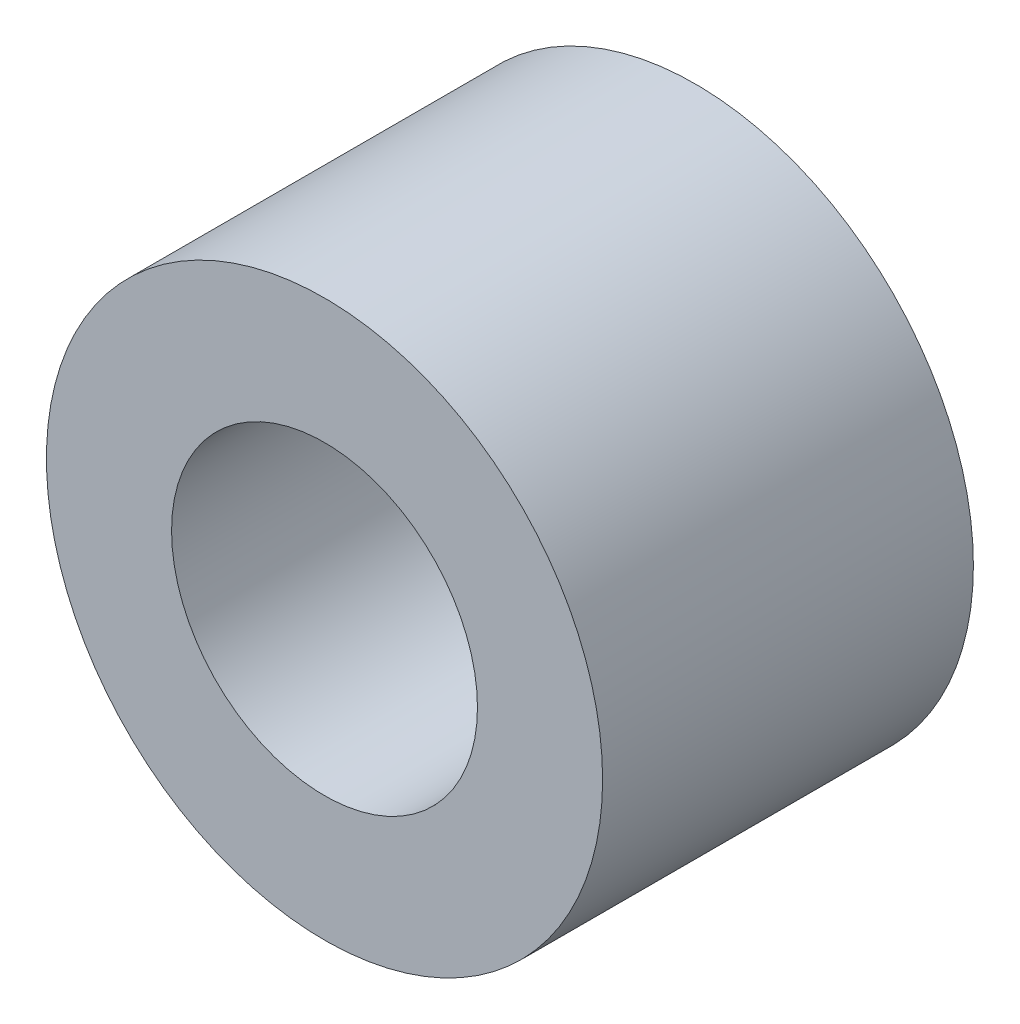
ISO-10303-21;
HEADER;
FILE_DESCRIPTION(('STEP AP214'),'2;1');
FILE_NAME('part.step','',(''),(''),'','','');
FILE_SCHEMA(('AUTOMOTIVE_DESIGN { 1 0 10303 214 1 1 1 1 }'));
ENDSEC;
DATA;
#1=APPLICATION_CONTEXT('core data for automotive mechanical design processes');
#2=APPLICATION_PROTOCOL_DEFINITION('international standard','automotive_design',2000,#1);
#3=PRODUCT_CONTEXT('',#1,'mechanical');
#4=PRODUCT('Part','Part','',(#3));
#5=PRODUCT_RELATED_PRODUCT_CATEGORY('part','',(#4));
#6=PRODUCT_DEFINITION_FORMATION('','',#4);
#7=PRODUCT_DEFINITION_CONTEXT('part definition',#1,'design');
#8=PRODUCT_DEFINITION('design','',#6,#7);
#9=PRODUCT_DEFINITION_SHAPE('','',#8);
#10=(LENGTH_UNIT() NAMED_UNIT(*) SI_UNIT(.MILLI.,.METRE.));
#11=(NAMED_UNIT(*) PLANE_ANGLE_UNIT() SI_UNIT($,.RADIAN.));
#12=(NAMED_UNIT(*) SI_UNIT($,.STERADIAN.) SOLID_ANGLE_UNIT());
#13=UNCERTAINTY_MEASURE_WITH_UNIT(LENGTH_MEASURE(1.E-05),#10,'distance_accuracy_value','');
#14=(GEOMETRIC_REPRESENTATION_CONTEXT(3) GLOBAL_UNCERTAINTY_ASSIGNED_CONTEXT((#13)) GLOBAL_UNIT_ASSIGNED_CONTEXT((#10,
#11,#12)) REPRESENTATION_CONTEXT('',''));
#15=CARTESIAN_POINT('',(0.,0.,0.));
#16=DIRECTION('',(0.,0.,1.));
#17=DIRECTION('',(1.,0.,0.));
#18=AXIS2_PLACEMENT_3D('',#15,#16,#17);
#19=CARTESIAN_POINT('',(0.,0.,-1.));
#20=DIRECTION('',(0.,0.,1.));
#21=DIRECTION('',(1.,0.,0.));
#22=AXIS2_PLACEMENT_3D('',#19,#20,#21);
#23=CYLINDRICAL_SURFACE('',#22,3.3);
#24=DIRECTION('',(0.,0.,1.));
#25=VECTOR('',#24,1.);
#26=CARTESIAN_POINT('',(3.3,0.,-1.));
#27=LINE('',#26,#25);
#28=CARTESIAN_POINT('',(3.3,0.,0.));
#29=VERTEX_POINT('',#28);
#30=CARTESIAN_POINT('',(3.3,0.,8.));
#31=VERTEX_POINT('',#30);
#32=EDGE_CURVE('E11',#29,#31,#27,.T.);
#33=ORIENTED_EDGE('',*,*,#32,.F.);
#34=CARTESIAN_POINT('',(0.,0.,0.));
#35=DIRECTION('',(0.,0.,1.));
#36=DIRECTION('',(1.,0.,0.));
#37=AXIS2_PLACEMENT_3D('',#34,#35,#36);
#38=CIRCLE('',#37,3.3);
#39=EDGE_CURVE('E26',#29,#29,#38,.T.);
#40=ORIENTED_EDGE('',*,*,#39,.F.);
#41=ORIENTED_EDGE('',*,*,#32,.T.);
#42=CARTESIAN_POINT('',(0.,0.,8.));
#43=DIRECTION('',(0.,0.,1.));
#44=DIRECTION('',(1.,0.,0.));
#45=AXIS2_PLACEMENT_3D('',#42,#43,#44);
#46=CIRCLE('',#45,3.3);
#47=EDGE_CURVE('E69',#31,#31,#46,.T.);
#48=ORIENTED_EDGE('',*,*,#47,.T.);
#49=EDGE_LOOP('',(#33,#40,#41,#48));
#50=FACE_BOUND('',#49,.T.);
#51=ADVANCED_FACE('F18',(#50),#23,.F.);
#52=CARTESIAN_POINT('',(0.,0.,0.));
#53=DIRECTION('',(0.,0.,1.));
#54=DIRECTION('',(1.,0.,0.));
#55=AXIS2_PLACEMENT_3D('',#52,#53,#54);
#56=PLANE('',#55);
#57=ORIENTED_EDGE('',*,*,#39,.T.);
#58=EDGE_LOOP('',(#57));
#59=FACE_BOUND('',#58,.T.);
#60=CARTESIAN_POINT('',(0.,0.,0.));
#61=DIRECTION('',(0.,0.,1.));
#62=DIRECTION('',(1.,0.,0.));
#63=AXIS2_PLACEMENT_3D('',#60,#61,#62);
#64=CIRCLE('',#63,6.);
#65=CARTESIAN_POINT('',(6.,0.,0.));
#66=VERTEX_POINT('',#65);
#67=EDGE_CURVE('E57',#66,#66,#64,.T.);
#68=ORIENTED_EDGE('',*,*,#67,.F.);
#69=EDGE_LOOP('',(#68));
#70=FACE_BOUND('',#69,.T.);
#71=ADVANCED_FACE('F74',(#59,#70),#56,.F.);
#72=CARTESIAN_POINT('',(0.,0.,8.));
#73=DIRECTION('',(0.,0.,1.));
#74=DIRECTION('',(1.,0.,0.));
#75=AXIS2_PLACEMENT_3D('',#72,#73,#74);
#76=PLANE('',#75);
#77=ORIENTED_EDGE('',*,*,#47,.F.);
#78=EDGE_LOOP('',(#77));
#79=FACE_BOUND('',#78,.T.);
#80=CARTESIAN_POINT('',(0.,0.,8.));
#81=DIRECTION('',(0.,0.,1.));
#82=DIRECTION('',(1.,0.,0.));
#83=AXIS2_PLACEMENT_3D('',#80,#81,#82);
#84=CIRCLE('',#83,6.);
#85=CARTESIAN_POINT('',(6.,0.,8.));
#86=VERTEX_POINT('',#85);
#87=EDGE_CURVE('E55',#86,#86,#84,.T.);
#88=ORIENTED_EDGE('',*,*,#87,.T.);
#89=EDGE_LOOP('',(#88));
#90=FACE_BOUND('',#89,.T.);
#91=ADVANCED_FACE('F61',(#79,#90),#76,.T.);
#92=CARTESIAN_POINT('',(0.,0.,0.));
#93=DIRECTION('',(0.,0.,1.));
#94=DIRECTION('',(1.,0.,0.));
#95=AXIS2_PLACEMENT_3D('',#92,#93,#94);
#96=CYLINDRICAL_SURFACE('',#95,6.);
#97=ORIENTED_EDGE('',*,*,#87,.F.);
#98=DIRECTION('',(0.,0.,1.));
#99=VECTOR('',#98,1.);
#100=CARTESIAN_POINT('',(6.,0.,0.));
#101=LINE('',#100,#99);
#102=EDGE_CURVE('E52',#66,#86,#101,.T.);
#103=ORIENTED_EDGE('',*,*,#102,.F.);
#104=ORIENTED_EDGE('',*,*,#67,.T.);
#105=ORIENTED_EDGE('',*,*,#102,.T.);
#106=EDGE_LOOP('',(#97,#103,#104,#105));
#107=FACE_BOUND('',#106,.T.);
#108=ADVANCED_FACE('F54',(#107),#96,.T.);
#109=CLOSED_SHELL('',(#51,#71,#91,#108));
#110=MANIFOLD_SOLID_BREP('B1',#109);
#111=ADVANCED_BREP_SHAPE_REPRESENTATION('',(#18,#110),#14);
#112=SHAPE_DEFINITION_REPRESENTATION(#9,#111);
ENDSEC;
END-ISO-10303-21;
